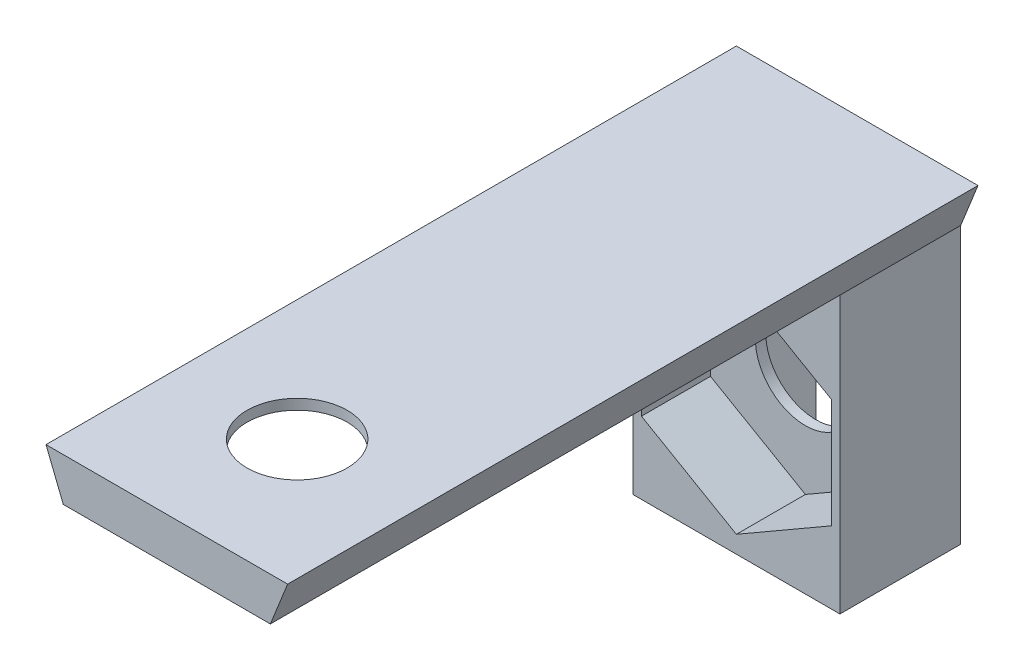
ISO-10303-21;
HEADER;
FILE_DESCRIPTION(('STEP AP214'),'2;1');
FILE_NAME('part.step','',(''),(''),'','','');
FILE_SCHEMA(('AUTOMOTIVE_DESIGN { 1 0 10303 214 1 1 1 1 }'));
ENDSEC;
DATA;
#1=APPLICATION_CONTEXT('core data for automotive mechanical design processes');
#2=APPLICATION_PROTOCOL_DEFINITION('international standard','automotive_design',2000,#1);
#3=PRODUCT_CONTEXT('',#1,'mechanical');
#4=PRODUCT('Part','Part','',(#3));
#5=PRODUCT_RELATED_PRODUCT_CATEGORY('part','',(#4));
#6=PRODUCT_DEFINITION_FORMATION('','',#4);
#7=PRODUCT_DEFINITION_CONTEXT('part definition',#1,'design');
#8=PRODUCT_DEFINITION('design','',#6,#7);
#9=PRODUCT_DEFINITION_SHAPE('','',#8);
#10=(LENGTH_UNIT() NAMED_UNIT(*) SI_UNIT(.MILLI.,.METRE.));
#11=(NAMED_UNIT(*) PLANE_ANGLE_UNIT() SI_UNIT($,.RADIAN.));
#12=(NAMED_UNIT(*) SI_UNIT($,.STERADIAN.) SOLID_ANGLE_UNIT());
#13=UNCERTAINTY_MEASURE_WITH_UNIT(LENGTH_MEASURE(1.E-05),#10,'distance_accuracy_value','');
#14=(GEOMETRIC_REPRESENTATION_CONTEXT(3) GLOBAL_UNCERTAINTY_ASSIGNED_CONTEXT((#13)) GLOBAL_UNIT_ASSIGNED_CONTEXT((#10,
#11,#12)) REPRESENTATION_CONTEXT('',''));
#15=CARTESIAN_POINT('',(0.,0.,0.));
#16=DIRECTION('',(0.,0.,1.));
#17=DIRECTION('',(1.,0.,0.));
#18=AXIS2_PLACEMENT_3D('',#15,#16,#17);
#19=CARTESIAN_POINT('',(0.,7.35,-3.501));
#20=DIRECTION('',(0.,0.,1.));
#21=DIRECTION('',(1.,0.,0.));
#22=AXIS2_PLACEMENT_3D('',#19,#20,#21);
#23=CYLINDRICAL_SURFACE('',#22,2.90000000000001);
#24=CARTESIAN_POINT('',(0.,7.35,-1.1));
#25=DIRECTION('',(0.,0.,1.));
#26=DIRECTION('',(1.,0.,0.));
#27=AXIS2_PLACEMENT_3D('',#24,#25,#26);
#28=CIRCLE('',#27,2.90000000000001);
#29=CARTESIAN_POINT('',(2.90000000000001,7.35,-1.1));
#30=VERTEX_POINT('',#29);
#31=EDGE_CURVE('E324',#30,#30,#28,.F.);
#32=ORIENTED_EDGE('',*,*,#31,.T.);
#33=EDGE_LOOP('',(#32));
#34=FACE_BOUND('',#33,.T.);
#35=CARTESIAN_POINT('',(0.,7.35,-0.500000000000002));
#36=DIRECTION('',(0.,0.,1.));
#37=DIRECTION('',(1.,0.,0.));
#38=AXIS2_PLACEMENT_3D('',#35,#36,#37);
#39=CIRCLE('',#38,2.90000000000001);
#40=CARTESIAN_POINT('',(2.90000000000001,7.35,-0.500000000000002));
#41=VERTEX_POINT('',#40);
#42=EDGE_CURVE('E38',#41,#41,#39,.F.);
#43=ORIENTED_EDGE('',*,*,#42,.F.);
#44=EDGE_LOOP('',(#43));
#45=FACE_BOUND('',#44,.T.);
#46=ADVANCED_FACE('F34',(#34,#45),#23,.F.);
#47=CARTESIAN_POINT('',(6.,16.,3.5));
#48=DIRECTION('',(-1.,0.,0.));
#49=DIRECTION('',(0.,0.,1.));
#50=AXIS2_PLACEMENT_3D('',#47,#48,#49);
#51=PLANE('',#50);
#52=DIRECTION('',(0.,0.,-1.));
#53=VECTOR('',#52,1.);
#54=CARTESIAN_POINT('',(6.,0.,3.5));
#55=LINE('',#54,#53);
#56=CARTESIAN_POINT('',(6.,0.,3.5));
#57=VERTEX_POINT('',#56);
#58=CARTESIAN_POINT('',(6.,0.,-3.5));
#59=VERTEX_POINT('',#58);
#60=EDGE_CURVE('E339',#57,#59,#55,.T.);
#61=ORIENTED_EDGE('',*,*,#60,.T.);
#62=DIRECTION('',(0.,-1.,0.));
#63=VECTOR('',#62,1.);
#64=CARTESIAN_POINT('',(6.,16.,-3.5));
#65=LINE('',#64,#63);
#66=CARTESIAN_POINT('',(6.,16.,-3.5));
#67=VERTEX_POINT('',#66);
#68=EDGE_CURVE('E371',#67,#59,#65,.T.);
#69=ORIENTED_EDGE('',*,*,#68,.F.);
#70=DIRECTION('',(0.,0.,-1.));
#71=VECTOR('',#70,1.);
#72=CARTESIAN_POINT('',(6.,16.,3.5));
#73=LINE('',#72,#71);
#74=CARTESIAN_POINT('',(6.,16.,3.5));
#75=VERTEX_POINT('',#74);
#76=EDGE_CURVE('E345',#75,#67,#73,.T.);
#77=ORIENTED_EDGE('',*,*,#76,.F.);
#78=DIRECTION('',(0.,-1.,0.));
#79=VECTOR('',#78,1.);
#80=CARTESIAN_POINT('',(6.,16.,3.5));
#81=LINE('',#80,#79);
#82=EDGE_CURVE('E353',#75,#57,#81,.T.);
#83=ORIENTED_EDGE('',*,*,#82,.T.);
#84=EDGE_LOOP('',(#61,#69,#77,#83));
#85=FACE_BOUND('',#84,.T.);
#86=ADVANCED_FACE('F36',(#85),#51,.F.);
#87=CARTESIAN_POINT('',(-6.,16.,-3.5));
#88=DIRECTION('',(0.,0.,1.));
#89=DIRECTION('',(1.,0.,0.));
#90=AXIS2_PLACEMENT_3D('',#87,#88,#89);
#91=PLANE('',#90);
#92=DIRECTION('',(-1.,0.,0.));
#93=VECTOR('',#92,1.);
#94=CARTESIAN_POINT('',(-7.,18.5,-3.5));
#95=LINE('',#94,#93);
#96=CARTESIAN_POINT('',(7.,18.5,-3.5));
#97=VERTEX_POINT('',#96);
#98=CARTESIAN_POINT('',(-7.,18.5,-3.5));
#99=VERTEX_POINT('',#98);
#100=EDGE_CURVE('E271',#97,#99,#95,.T.);
#101=ORIENTED_EDGE('',*,*,#100,.F.);
#102=DIRECTION('',(0.371390676354104,0.928476690885259,0.));
#103=VECTOR('',#102,1.);
#104=CARTESIAN_POINT('',(7.,18.5,-3.5));
#105=LINE('',#104,#103);
#106=EDGE_CURVE('E248',#67,#97,#105,.T.);
#107=ORIENTED_EDGE('',*,*,#106,.F.);
#108=ORIENTED_EDGE('',*,*,#68,.T.);
#109=DIRECTION('',(-1.,0.,0.));
#110=VECTOR('',#109,1.);
#111=CARTESIAN_POINT('',(-6.,0.,-3.5));
#112=LINE('',#111,#110);
#113=CARTESIAN_POINT('',(2.4,0.,-3.5));
#114=VERTEX_POINT('',#113);
#115=EDGE_CURVE('E357',#59,#114,#112,.T.);
#116=ORIENTED_EDGE('',*,*,#115,.T.);
#117=DIRECTION('',(0.,1.,0.));
#118=VECTOR('',#117,1.);
#119=CARTESIAN_POINT('',(2.4,-4.,-3.5));
#120=LINE('',#119,#118);
#121=CARTESIAN_POINT('',(2.4,16.,-3.5));
#122=VERTEX_POINT('',#121);
#123=EDGE_CURVE('E336',#114,#122,#120,.T.);
#124=ORIENTED_EDGE('',*,*,#123,.T.);
#125=DIRECTION('',(-1.,0.,0.));
#126=VECTOR('',#125,1.);
#127=CARTESIAN_POINT('',(-7.,16.,-3.5));
#128=LINE('',#127,#126);
#129=CARTESIAN_POINT('',(-2.4,16.,-3.5));
#130=VERTEX_POINT('',#129);
#131=EDGE_CURVE('E265',#122,#130,#128,.T.);
#132=ORIENTED_EDGE('',*,*,#131,.T.);
#133=DIRECTION('',(0.,1.,0.));
#134=VECTOR('',#133,1.);
#135=CARTESIAN_POINT('',(-2.4,-4.,-3.5));
#136=LINE('',#135,#134);
#137=CARTESIAN_POINT('',(-2.4,0.,-3.5));
#138=VERTEX_POINT('',#137);
#139=EDGE_CURVE('E335',#138,#130,#136,.T.);
#140=ORIENTED_EDGE('',*,*,#139,.F.);
#141=CARTESIAN_POINT('',(-6.,0.,-3.5));
#142=VERTEX_POINT('',#141);
#143=EDGE_CURVE('E356',#138,#142,#112,.T.);
#144=ORIENTED_EDGE('',*,*,#143,.T.);
#145=DIRECTION('',(0.,-1.,0.));
#146=VECTOR('',#145,1.);
#147=CARTESIAN_POINT('',(-6.,16.,-3.5));
#148=LINE('',#147,#146);
#149=CARTESIAN_POINT('',(-6.,16.,-3.5));
#150=VERTEX_POINT('',#149);
#151=EDGE_CURVE('E368',#150,#142,#148,.T.);
#152=ORIENTED_EDGE('',*,*,#151,.F.);
#153=DIRECTION('',(0.371390676354104,-0.928476690885259,0.));
#154=VECTOR('',#153,1.);
#155=CARTESIAN_POINT('',(-6.,16.,-3.5));
#156=LINE('',#155,#154);
#157=EDGE_CURVE('E240',#99,#150,#156,.T.);
#158=ORIENTED_EDGE('',*,*,#157,.F.);
#159=EDGE_LOOP('',(#101,#107,#108,#116,#124,#132,#140,#144,#152,#158));
#160=FACE_BOUND('',#159,.T.);
#161=ADVANCED_FACE('F393',(#160),#91,.F.);
#162=CARTESIAN_POINT('',(-6.,16.,3.5));
#163=DIRECTION('',(1.,0.,0.));
#164=DIRECTION('',(0.,0.,-1.));
#165=AXIS2_PLACEMENT_3D('',#162,#163,#164);
#166=PLANE('',#165);
#167=DIRECTION('',(0.,0.,1.));
#168=VECTOR('',#167,1.);
#169=CARTESIAN_POINT('',(-6.,0.,3.5));
#170=LINE('',#169,#168);
#171=CARTESIAN_POINT('',(-6.,0.,3.5));
#172=VERTEX_POINT('',#171);
#173=EDGE_CURVE('E360',#142,#172,#170,.T.);
#174=ORIENTED_EDGE('',*,*,#173,.T.);
#175=DIRECTION('',(0.,-1.,0.));
#176=VECTOR('',#175,1.);
#177=CARTESIAN_POINT('',(-6.,16.,3.5));
#178=LINE('',#177,#176);
#179=CARTESIAN_POINT('',(-6.,16.,3.5));
#180=VERTEX_POINT('',#179);
#181=EDGE_CURVE('E365',#180,#172,#178,.T.);
#182=ORIENTED_EDGE('',*,*,#181,.F.);
#183=DIRECTION('',(0.,0.,1.));
#184=VECTOR('',#183,1.);
#185=CARTESIAN_POINT('',(-6.,16.,3.5));
#186=LINE('',#185,#184);
#187=EDGE_CURVE('E347',#150,#180,#186,.T.);
#188=ORIENTED_EDGE('',*,*,#187,.F.);
#189=ORIENTED_EDGE('',*,*,#151,.T.);
#190=EDGE_LOOP('',(#174,#182,#188,#189));
#191=FACE_BOUND('',#190,.T.);
#192=ADVANCED_FACE('F415',(#191),#166,.F.);
#193=CARTESIAN_POINT('',(-6.,16.,3.5));
#194=DIRECTION('',(0.,0.,-1.));
#195=DIRECTION('',(-1.,0.,0.));
#196=AXIS2_PLACEMENT_3D('',#193,#194,#195);
#197=PLANE('',#196);
#198=DIRECTION('',(-0.866025403784439,-0.5,0.));
#199=VECTOR('',#198,1.);
#200=CARTESIAN_POINT('',(0.,13.7008529610859,3.5));
#201=LINE('',#200,#199);
#202=CARTESIAN_POINT('',(0.,13.7008529610859,3.5));
#203=VERTEX_POINT('',#202);
#204=CARTESIAN_POINT('',(-5.5,10.5254264805429,3.5));
#205=VERTEX_POINT('',#204);
#206=EDGE_CURVE('E299',#203,#205,#201,.T.);
#207=ORIENTED_EDGE('',*,*,#206,.F.);
#208=DIRECTION('',(-0.866025403784439,0.5,0.));
#209=VECTOR('',#208,1.);
#210=CARTESIAN_POINT('',(5.5,10.5254264805429,3.5));
#211=LINE('',#210,#209);
#212=CARTESIAN_POINT('',(5.5,10.5254264805429,3.5));
#213=VERTEX_POINT('',#212);
#214=EDGE_CURVE('E58',#213,#203,#211,.T.);
#215=ORIENTED_EDGE('',*,*,#214,.F.);
#216=DIRECTION('',(0.,1.,0.));
#217=VECTOR('',#216,1.);
#218=CARTESIAN_POINT('',(5.5,4.17457351945706,3.5));
#219=LINE('',#218,#217);
#220=CARTESIAN_POINT('',(5.5,4.17457351945706,3.5));
#221=VERTEX_POINT('',#220);
#222=EDGE_CURVE('E282',#221,#213,#219,.T.);
#223=ORIENTED_EDGE('',*,*,#222,.F.);
#224=DIRECTION('',(0.866025403784439,0.5,0.));
#225=VECTOR('',#224,1.);
#226=CARTESIAN_POINT('',(0.,0.999147038914116,3.5));
#227=LINE('',#226,#225);
#228=CARTESIAN_POINT('',(0.,0.999147038914116,3.5));
#229=VERTEX_POINT('',#228);
#230=EDGE_CURVE('E308',#229,#221,#227,.T.);
#231=ORIENTED_EDGE('',*,*,#230,.F.);
#232=DIRECTION('',(0.866025403784439,-0.5,0.));
#233=VECTOR('',#232,1.);
#234=CARTESIAN_POINT('',(-5.5,4.17457351945706,3.5));
#235=LINE('',#234,#233);
#236=CARTESIAN_POINT('',(-5.5,4.17457351945706,3.5));
#237=VERTEX_POINT('',#236);
#238=EDGE_CURVE('E305',#237,#229,#235,.T.);
#239=ORIENTED_EDGE('',*,*,#238,.F.);
#240=DIRECTION('',(0.,-1.,0.));
#241=VECTOR('',#240,1.);
#242=CARTESIAN_POINT('',(-5.5,10.5254264805429,3.5));
#243=LINE('',#242,#241);
#244=EDGE_CURVE('E302',#205,#237,#243,.T.);
#245=ORIENTED_EDGE('',*,*,#244,.F.);
#246=EDGE_LOOP('',(#207,#215,#223,#231,#239,#245));
#247=FACE_BOUND('',#246,.T.);
#248=DIRECTION('',(1.,0.,0.));
#249=VECTOR('',#248,1.);
#250=CARTESIAN_POINT('',(-6.,0.,3.5));
#251=LINE('',#250,#249);
#252=EDGE_CURVE('E348',#172,#57,#251,.T.);
#253=ORIENTED_EDGE('',*,*,#252,.T.);
#254=ORIENTED_EDGE('',*,*,#82,.F.);
#255=DIRECTION('',(1.,0.,0.));
#256=VECTOR('',#255,1.);
#257=CARTESIAN_POINT('',(-6.,16.,3.5));
#258=LINE('',#257,#256);
#259=EDGE_CURVE('E350',#180,#75,#258,.T.);
#260=ORIENTED_EDGE('',*,*,#259,.F.);
#261=ORIENTED_EDGE('',*,*,#181,.T.);
#262=EDGE_LOOP('',(#253,#254,#260,#261));
#263=FACE_BOUND('',#262,.T.);
#264=ADVANCED_FACE('F410',(#247,#263),#197,.F.);
#265=CARTESIAN_POINT('',(0.,0.,0.));
#266=DIRECTION('',(0.,-1.,0.));
#267=DIRECTION('',(0.,0.,-1.));
#268=AXIS2_PLACEMENT_3D('',#265,#266,#267);
#269=PLANE('',#268);
#270=DIRECTION('',(0.707106781186546,0.,0.707106781186549));
#271=VECTOR('',#270,1.);
#272=CARTESIAN_POINT('',(2.95000000000001,0.,-2.94999999999999));
#273=LINE('',#272,#271);
#274=CARTESIAN_POINT('',(4.79999999999999,0.,-1.1));
#275=VERTEX_POINT('',#274);
#276=EDGE_CURVE('E11',#114,#275,#273,.T.);
#277=ORIENTED_EDGE('',*,*,#276,.F.);
#278=ORIENTED_EDGE('',*,*,#115,.F.);
#279=ORIENTED_EDGE('',*,*,#60,.F.);
#280=ORIENTED_EDGE('',*,*,#252,.F.);
#281=ORIENTED_EDGE('',*,*,#173,.F.);
#282=ORIENTED_EDGE('',*,*,#143,.F.);
#283=DIRECTION('',(0.707106781186551,0.,-0.707106781186544));
#284=VECTOR('',#283,1.);
#285=CARTESIAN_POINT('',(-2.94999999999999,0.,-2.95000000000002));
#286=LINE('',#285,#284);
#287=CARTESIAN_POINT('',(-4.80000000000002,0.,-1.1));
#288=VERTEX_POINT('',#287);
#289=EDGE_CURVE('E374',#288,#138,#286,.T.);
#290=ORIENTED_EDGE('',*,*,#289,.F.);
#291=DIRECTION('',(-1.,0.,0.));
#292=VECTOR('',#291,1.);
#293=CARTESIAN_POINT('',(0.,0.,-1.1));
#294=LINE('',#293,#292);
#295=EDGE_CURVE('E43',#275,#288,#294,.T.);
#296=ORIENTED_EDGE('',*,*,#295,.F.);
#297=EDGE_LOOP('',(#277,#278,#279,#280,#281,#282,#290,#296));
#298=FACE_BOUND('',#297,.T.);
#299=ADVANCED_FACE('F385',(#298),#269,.T.);
#300=CARTESIAN_POINT('',(2.4,-4.,-3.5));
#301=DIRECTION('',(0.707106781186549,0.,-0.707106781186546));
#302=DIRECTION('',(-0.707106781186546,0.,-0.707106781186549));
#303=AXIS2_PLACEMENT_3D('',#300,#301,#302);
#304=PLANE('',#303);
#305=ORIENTED_EDGE('',*,*,#276,.T.);
#306=DIRECTION('',(0.,1.,0.));
#307=VECTOR('',#306,1.);
#308=CARTESIAN_POINT('',(4.79999999999999,-4.,-1.1));
#309=LINE('',#308,#307);
#310=CARTESIAN_POINT('',(4.79999999999999,16.,-1.1));
#311=VERTEX_POINT('',#310);
#312=EDGE_CURVE('E340',#275,#311,#309,.T.);
#313=ORIENTED_EDGE('',*,*,#312,.T.);
#314=DIRECTION('',(-0.707106781186546,0.,-0.707106781186549));
#315=VECTOR('',#314,1.);
#316=CARTESIAN_POINT('',(2.4,16.,-3.5));
#317=LINE('',#316,#315);
#318=EDGE_CURVE('E333',#311,#122,#317,.T.);
#319=ORIENTED_EDGE('',*,*,#318,.T.);
#320=ORIENTED_EDGE('',*,*,#123,.F.);
#321=EDGE_LOOP('',(#305,#313,#319,#320));
#322=FACE_BOUND('',#321,.T.);
#323=ADVANCED_FACE('F401',(#322),#304,.F.);
#324=CARTESIAN_POINT('',(0.,-4.,-1.1));
#325=DIRECTION('',(0.,0.,1.));
#326=DIRECTION('',(1.,0.,0.));
#327=AXIS2_PLACEMENT_3D('',#324,#325,#326);
#328=PLANE('',#327);
#329=ORIENTED_EDGE('',*,*,#31,.F.);
#330=EDGE_LOOP('',(#329));
#331=FACE_BOUND('',#330,.T.);
#332=ORIENTED_EDGE('',*,*,#295,.T.);
#333=DIRECTION('',(0.,1.,0.));
#334=VECTOR('',#333,1.);
#335=CARTESIAN_POINT('',(-4.80000000000002,-4.,-1.1));
#336=LINE('',#335,#334);
#337=CARTESIAN_POINT('',(-4.80000000000002,16.,-1.1));
#338=VERTEX_POINT('',#337);
#339=EDGE_CURVE('E342',#288,#338,#336,.T.);
#340=ORIENTED_EDGE('',*,*,#339,.T.);
#341=DIRECTION('',(1.,0.,0.));
#342=VECTOR('',#341,1.);
#343=CARTESIAN_POINT('',(0.,16.,-1.1));
#344=LINE('',#343,#342);
#345=EDGE_CURVE('E330',#338,#311,#344,.T.);
#346=ORIENTED_EDGE('',*,*,#345,.T.);
#347=ORIENTED_EDGE('',*,*,#312,.F.);
#348=EDGE_LOOP('',(#332,#340,#346,#347));
#349=FACE_BOUND('',#348,.T.);
#350=ADVANCED_FACE('F381',(#331,#349),#328,.F.);
#351=CARTESIAN_POINT('',(-2.4,-4.,-3.5));
#352=DIRECTION('',(-0.707106781186544,0.,-0.707106781186551));
#353=DIRECTION('',(-0.707106781186551,0.,0.707106781186544));
#354=AXIS2_PLACEMENT_3D('',#351,#352,#353);
#355=PLANE('',#354);
#356=ORIENTED_EDGE('',*,*,#289,.T.);
#357=ORIENTED_EDGE('',*,*,#139,.T.);
#358=DIRECTION('',(-0.707106781186551,0.,0.707106781186544));
#359=VECTOR('',#358,1.);
#360=CARTESIAN_POINT('',(-2.4,16.,-3.5));
#361=LINE('',#360,#359);
#362=EDGE_CURVE('E327',#130,#338,#361,.T.);
#363=ORIENTED_EDGE('',*,*,#362,.T.);
#364=ORIENTED_EDGE('',*,*,#339,.F.);
#365=EDGE_LOOP('',(#356,#357,#363,#364));
#366=FACE_BOUND('',#365,.T.);
#367=ADVANCED_FACE('F389',(#366),#355,.F.);
#368=CARTESIAN_POINT('',(0.,0.,-0.500000000000002));
#369=DIRECTION('',(0.,0.,1.));
#370=DIRECTION('',(1.,0.,0.));
#371=AXIS2_PLACEMENT_3D('',#368,#369,#370);
#372=PLANE('',#371);
#373=DIRECTION('',(-0.866025403784439,0.5,0.));
#374=VECTOR('',#373,1.);
#375=CARTESIAN_POINT('',(5.5,10.5254264805429,-0.500000000000002));
#376=LINE('',#375,#374);
#377=CARTESIAN_POINT('',(5.5,10.5254264805429,-0.500000000000002));
#378=VERTEX_POINT('',#377);
#379=CARTESIAN_POINT('',(0.,13.7008529610859,-0.500000000000002));
#380=VERTEX_POINT('',#379);
#381=EDGE_CURVE('E278',#378,#380,#376,.T.);
#382=ORIENTED_EDGE('',*,*,#381,.T.);
#383=DIRECTION('',(-0.866025403784439,-0.5,0.));
#384=VECTOR('',#383,1.);
#385=CARTESIAN_POINT('',(0.,13.7008529610859,-0.500000000000002));
#386=LINE('',#385,#384);
#387=CARTESIAN_POINT('',(-5.5,10.5254264805429,-0.500000000000002));
#388=VERTEX_POINT('',#387);
#389=EDGE_CURVE('E281',#380,#388,#386,.T.);
#390=ORIENTED_EDGE('',*,*,#389,.T.);
#391=DIRECTION('',(0.,-1.,0.));
#392=VECTOR('',#391,1.);
#393=CARTESIAN_POINT('',(-5.5,10.5254264805429,-0.500000000000002));
#394=LINE('',#393,#392);
#395=CARTESIAN_POINT('',(-5.5,4.17457351945706,-0.500000000000002));
#396=VERTEX_POINT('',#395);
#397=EDGE_CURVE('E285',#388,#396,#394,.T.);
#398=ORIENTED_EDGE('',*,*,#397,.T.);
#399=DIRECTION('',(0.866025403784439,-0.5,0.));
#400=VECTOR('',#399,1.);
#401=CARTESIAN_POINT('',(-5.5,4.17457351945706,-0.500000000000002));
#402=LINE('',#401,#400);
#403=CARTESIAN_POINT('',(0.,0.999147038914116,-0.500000000000002));
#404=VERTEX_POINT('',#403);
#405=EDGE_CURVE('E288',#396,#404,#402,.T.);
#406=ORIENTED_EDGE('',*,*,#405,.T.);
#407=DIRECTION('',(0.866025403784439,0.5,0.));
#408=VECTOR('',#407,1.);
#409=CARTESIAN_POINT('',(0.,0.999147038914116,-0.500000000000002));
#410=LINE('',#409,#408);
#411=CARTESIAN_POINT('',(5.5,4.17457351945706,-0.500000000000002));
#412=VERTEX_POINT('',#411);
#413=EDGE_CURVE('E291',#404,#412,#410,.T.);
#414=ORIENTED_EDGE('',*,*,#413,.T.);
#415=DIRECTION('',(0.,1.,0.));
#416=VECTOR('',#415,1.);
#417=CARTESIAN_POINT('',(5.5,4.17457351945706,-0.500000000000002));
#418=LINE('',#417,#416);
#419=EDGE_CURVE('E294',#412,#378,#418,.T.);
#420=ORIENTED_EDGE('',*,*,#419,.T.);
#421=EDGE_LOOP('',(#382,#390,#398,#406,#414,#420));
#422=FACE_BOUND('',#421,.T.);
#423=ORIENTED_EDGE('',*,*,#42,.T.);
#424=EDGE_LOOP('',(#423));
#425=FACE_BOUND('',#424,.T.);
#426=ADVANCED_FACE('F459',(#422,#425),#372,.T.);
#427=CARTESIAN_POINT('',(5.5,10.5254264805429,-0.500000000000002));
#428=DIRECTION('',(0.5,0.866025403784439,0.));
#429=DIRECTION('',(-0.866025403784439,0.5,0.));
#430=AXIS2_PLACEMENT_3D('',#427,#428,#429);
#431=PLANE('',#430);
#432=ORIENTED_EDGE('',*,*,#214,.T.);
#433=DIRECTION('',(0.,0.,1.));
#434=VECTOR('',#433,1.);
#435=CARTESIAN_POINT('',(0.,13.7008529610859,-0.500000000000002));
#436=LINE('',#435,#434);
#437=EDGE_CURVE('E297',#380,#203,#436,.T.);
#438=ORIENTED_EDGE('',*,*,#437,.F.);
#439=ORIENTED_EDGE('',*,*,#381,.F.);
#440=DIRECTION('',(0.,0.,1.));
#441=VECTOR('',#440,1.);
#442=CARTESIAN_POINT('',(5.5,10.5254264805429,-0.500000000000002));
#443=LINE('',#442,#441);
#444=EDGE_CURVE('E313',#378,#213,#443,.T.);
#445=ORIENTED_EDGE('',*,*,#444,.T.);
#446=EDGE_LOOP('',(#432,#438,#439,#445));
#447=FACE_BOUND('',#446,.T.);
#448=ADVANCED_FACE('F450',(#447),#431,.F.);
#449=CARTESIAN_POINT('',(5.5,4.17457351945706,-0.500000000000002));
#450=DIRECTION('',(1.,0.,0.));
#451=DIRECTION('',(0.,0.,-1.));
#452=AXIS2_PLACEMENT_3D('',#449,#450,#451);
#453=PLANE('',#452);
#454=ORIENTED_EDGE('',*,*,#222,.T.);
#455=ORIENTED_EDGE('',*,*,#444,.F.);
#456=ORIENTED_EDGE('',*,*,#419,.F.);
#457=DIRECTION('',(0.,0.,1.));
#458=VECTOR('',#457,1.);
#459=CARTESIAN_POINT('',(5.5,4.17457351945706,-0.500000000000002));
#460=LINE('',#459,#458);
#461=EDGE_CURVE('E315',#412,#221,#460,.T.);
#462=ORIENTED_EDGE('',*,*,#461,.T.);
#463=EDGE_LOOP('',(#454,#455,#456,#462));
#464=FACE_BOUND('',#463,.T.);
#465=ADVANCED_FACE('F511',(#464),#453,.F.);
#466=CARTESIAN_POINT('',(0.,0.999147038914116,-0.500000000000002));
#467=DIRECTION('',(0.5,-0.866025403784439,0.));
#468=DIRECTION('',(0.866025403784439,0.5,0.));
#469=AXIS2_PLACEMENT_3D('',#466,#467,#468);
#470=PLANE('',#469);
#471=ORIENTED_EDGE('',*,*,#230,.T.);
#472=ORIENTED_EDGE('',*,*,#461,.F.);
#473=ORIENTED_EDGE('',*,*,#413,.F.);
#474=DIRECTION('',(0.,0.,1.));
#475=VECTOR('',#474,1.);
#476=CARTESIAN_POINT('',(0.,0.999147038914116,-0.500000000000002));
#477=LINE('',#476,#475);
#478=EDGE_CURVE('E317',#404,#229,#477,.T.);
#479=ORIENTED_EDGE('',*,*,#478,.T.);
#480=EDGE_LOOP('',(#471,#472,#473,#479));
#481=FACE_BOUND('',#480,.T.);
#482=ADVANCED_FACE('F517',(#481),#470,.F.);
#483=CARTESIAN_POINT('',(-5.5,4.17457351945706,-0.500000000000002));
#484=DIRECTION('',(-0.5,-0.866025403784439,0.));
#485=DIRECTION('',(0.866025403784439,-0.5,0.));
#486=AXIS2_PLACEMENT_3D('',#483,#484,#485);
#487=PLANE('',#486);
#488=ORIENTED_EDGE('',*,*,#238,.T.);
#489=ORIENTED_EDGE('',*,*,#478,.F.);
#490=ORIENTED_EDGE('',*,*,#405,.F.);
#491=DIRECTION('',(0.,0.,1.));
#492=VECTOR('',#491,1.);
#493=CARTESIAN_POINT('',(-5.5,4.17457351945706,-0.500000000000002));
#494=LINE('',#493,#492);
#495=EDGE_CURVE('E319',#396,#237,#494,.T.);
#496=ORIENTED_EDGE('',*,*,#495,.T.);
#497=EDGE_LOOP('',(#488,#489,#490,#496));
#498=FACE_BOUND('',#497,.T.);
#499=ADVANCED_FACE('F525',(#498),#487,.F.);
#500=CARTESIAN_POINT('',(-5.5,10.5254264805429,-0.500000000000002));
#501=DIRECTION('',(-1.,0.,0.));
#502=DIRECTION('',(0.,0.,1.));
#503=AXIS2_PLACEMENT_3D('',#500,#501,#502);
#504=PLANE('',#503);
#505=ORIENTED_EDGE('',*,*,#244,.T.);
#506=ORIENTED_EDGE('',*,*,#495,.F.);
#507=ORIENTED_EDGE('',*,*,#397,.F.);
#508=DIRECTION('',(0.,0.,1.));
#509=VECTOR('',#508,1.);
#510=CARTESIAN_POINT('',(-5.5,10.5254264805429,-0.500000000000002));
#511=LINE('',#510,#509);
#512=EDGE_CURVE('E321',#388,#205,#511,.T.);
#513=ORIENTED_EDGE('',*,*,#512,.T.);
#514=EDGE_LOOP('',(#505,#506,#507,#513));
#515=FACE_BOUND('',#514,.T.);
#516=ADVANCED_FACE('F533',(#515),#504,.F.);
#517=CARTESIAN_POINT('',(0.,13.7008529610859,-0.500000000000002));
#518=DIRECTION('',(-0.5,0.866025403784439,0.));
#519=DIRECTION('',(-0.866025403784439,-0.5,0.));
#520=AXIS2_PLACEMENT_3D('',#517,#518,#519);
#521=PLANE('',#520);
#522=ORIENTED_EDGE('',*,*,#206,.T.);
#523=ORIENTED_EDGE('',*,*,#512,.F.);
#524=ORIENTED_EDGE('',*,*,#389,.F.);
#525=ORIENTED_EDGE('',*,*,#437,.T.);
#526=EDGE_LOOP('',(#522,#523,#524,#525));
#527=FACE_BOUND('',#526,.T.);
#528=ADVANCED_FACE('F541',(#527),#521,.F.);
#529=CARTESIAN_POINT('',(0.,16.,0.));
#530=DIRECTION('',(0.,1.,0.));
#531=DIRECTION('',(0.,0.,1.));
#532=AXIS2_PLACEMENT_3D('',#529,#530,#531);
#533=PLANE('',#532);
#534=DIRECTION('',(0.866025403784439,0.,0.5));
#535=VECTOR('',#534,1.);
#536=CARTESIAN_POINT('',(0.,16.,22.5991470389141));
#537=LINE('',#536,#535);
#538=CARTESIAN_POINT('',(0.,16.,22.5991470389141));
#539=VERTEX_POINT('',#538);
#540=CARTESIAN_POINT('',(5.50000000000001,16.,25.7745735194571));
#541=VERTEX_POINT('',#540);
#542=EDGE_CURVE('E227',#539,#541,#537,.T.);
#543=ORIENTED_EDGE('',*,*,#542,.F.);
#544=DIRECTION('',(0.866025403784439,0.,-0.5));
#545=VECTOR('',#544,1.);
#546=CARTESIAN_POINT('',(-5.5,16.,25.7745735194571));
#547=LINE('',#546,#545);
#548=CARTESIAN_POINT('',(-5.5,16.,25.7745735194571));
#549=VERTEX_POINT('',#548);
#550=EDGE_CURVE('E50',#549,#539,#547,.T.);
#551=ORIENTED_EDGE('',*,*,#550,.F.);
#552=DIRECTION('',(0.,0.,-1.));
#553=VECTOR('',#552,1.);
#554=CARTESIAN_POINT('',(-5.5,16.,32.1254264805429));
#555=LINE('',#554,#553);
#556=CARTESIAN_POINT('',(-5.5,16.,32.1254264805429));
#557=VERTEX_POINT('',#556);
#558=EDGE_CURVE('E210',#557,#549,#555,.T.);
#559=ORIENTED_EDGE('',*,*,#558,.F.);
#560=DIRECTION('',(-0.866025403784439,0.,-0.5));
#561=VECTOR('',#560,1.);
#562=CARTESIAN_POINT('',(0.,16.,35.3008529610859));
#563=LINE('',#562,#561);
#564=CARTESIAN_POINT('',(0.,16.,35.3008529610859));
#565=VERTEX_POINT('',#564);
#566=EDGE_CURVE('E213',#565,#557,#563,.T.);
#567=ORIENTED_EDGE('',*,*,#566,.F.);
#568=DIRECTION('',(-0.866025403784438,0.,0.5));
#569=VECTOR('',#568,1.);
#570=CARTESIAN_POINT('',(5.5,16.,32.1254264805429));
#571=LINE('',#570,#569);
#572=CARTESIAN_POINT('',(5.5,16.,32.1254264805429));
#573=VERTEX_POINT('',#572);
#574=EDGE_CURVE('E233',#573,#565,#571,.T.);
#575=ORIENTED_EDGE('',*,*,#574,.F.);
#576=DIRECTION('',(0.,0.,1.));
#577=VECTOR('',#576,1.);
#578=CARTESIAN_POINT('',(5.50000000000001,16.,25.7745735194571));
#579=LINE('',#578,#577);
#580=EDGE_CURVE('E230',#541,#573,#579,.T.);
#581=ORIENTED_EDGE('',*,*,#580,.F.);
#582=EDGE_LOOP('',(#543,#551,#559,#567,#575,#581));
#583=FACE_BOUND('',#582,.T.);
#584=ORIENTED_EDGE('',*,*,#259,.T.);
#585=DIRECTION('',(0.,0.,-1.));
#586=VECTOR('',#585,1.);
#587=CARTESIAN_POINT('',(6.,16.,36.501));
#588=LINE('',#587,#586);
#589=CARTESIAN_POINT('',(6.,16.,36.5));
#590=VERTEX_POINT('',#589);
#591=EDGE_CURVE('E250',#590,#75,#588,.T.);
#592=ORIENTED_EDGE('',*,*,#591,.F.);
#593=DIRECTION('',(1.,0.,0.));
#594=VECTOR('',#593,1.);
#595=CARTESIAN_POINT('',(-6.99999999999999,16.,36.5));
#596=LINE('',#595,#594);
#597=CARTESIAN_POINT('',(-6.,16.,36.5));
#598=VERTEX_POINT('',#597);
#599=EDGE_CURVE('E255',#598,#590,#596,.T.);
#600=ORIENTED_EDGE('',*,*,#599,.F.);
#601=DIRECTION('',(0.,0.,-1.));
#602=VECTOR('',#601,1.);
#603=CARTESIAN_POINT('',(-6.,16.,36.501));
#604=LINE('',#603,#602);
#605=EDGE_CURVE('E257',#598,#180,#604,.T.);
#606=ORIENTED_EDGE('',*,*,#605,.T.);
#607=EDGE_LOOP('',(#584,#592,#600,#606));
#608=FACE_BOUND('',#607,.T.);
#609=ADVANCED_FACE('F430',(#583,#608),#533,.F.);
#610=CARTESIAN_POINT('',(-6.99999999999999,18.5,36.5));
#611=DIRECTION('',(0.,0.,-1.));
#612=DIRECTION('',(-1.,0.,0.));
#613=AXIS2_PLACEMENT_3D('',#610,#611,#612);
#614=PLANE('',#613);
#615=ORIENTED_EDGE('',*,*,#599,.T.);
#616=DIRECTION('',(-0.371390676354104,-0.928476690885259,0.));
#617=VECTOR('',#616,1.);
#618=CARTESIAN_POINT('',(7.,18.5,36.5));
#619=LINE('',#618,#617);
#620=CARTESIAN_POINT('',(7.,18.5,36.5));
#621=VERTEX_POINT('',#620);
#622=EDGE_CURVE('E253',#621,#590,#619,.T.);
#623=ORIENTED_EDGE('',*,*,#622,.F.);
#624=DIRECTION('',(1.,0.,0.));
#625=VECTOR('',#624,1.);
#626=CARTESIAN_POINT('',(-6.99999999999999,18.5,36.5));
#627=LINE('',#626,#625);
#628=CARTESIAN_POINT('',(-6.99999999999999,18.5,36.5));
#629=VERTEX_POINT('',#628);
#630=EDGE_CURVE('E264',#629,#621,#627,.T.);
#631=ORIENTED_EDGE('',*,*,#630,.F.);
#632=DIRECTION('',(-0.371390676354104,0.928476690885259,0.));
#633=VECTOR('',#632,1.);
#634=CARTESIAN_POINT('',(-6.,16.,36.5));
#635=LINE('',#634,#633);
#636=EDGE_CURVE('E251',#598,#629,#635,.T.);
#637=ORIENTED_EDGE('',*,*,#636,.F.);
#638=EDGE_LOOP('',(#615,#623,#631,#637));
#639=FACE_BOUND('',#638,.T.);
#640=ADVANCED_FACE('F426',(#639),#614,.F.);
#641=CARTESIAN_POINT('',(0.,18.5,0.));
#642=DIRECTION('',(0.,1.,0.));
#643=DIRECTION('',(0.,0.,1.));
#644=AXIS2_PLACEMENT_3D('',#641,#642,#643);
#645=PLANE('',#644);
#646=CARTESIAN_POINT('',(0.,18.5,28.95));
#647=DIRECTION('',(0.,1.,0.));
#648=DIRECTION('',(0.,0.,1.));
#649=AXIS2_PLACEMENT_3D('',#646,#647,#648);
#650=CIRCLE('',#649,2.9);
#651=CARTESIAN_POINT('',(0.,18.5,31.85));
#652=VERTEX_POINT('',#651);
#653=EDGE_CURVE('E216',#652,#652,#650,.F.);
#654=ORIENTED_EDGE('',*,*,#653,.T.);
#655=EDGE_LOOP('',(#654));
#656=FACE_BOUND('',#655,.T.);
#657=DIRECTION('',(0.,0.,1.));
#658=VECTOR('',#657,1.);
#659=CARTESIAN_POINT('',(-7.,18.5,-3.5));
#660=LINE('',#659,#658);
#661=EDGE_CURVE('E261',#99,#629,#660,.T.);
#662=ORIENTED_EDGE('',*,*,#661,.T.);
#663=ORIENTED_EDGE('',*,*,#630,.T.);
#664=DIRECTION('',(0.,0.,-1.));
#665=VECTOR('',#664,1.);
#666=CARTESIAN_POINT('',(7.,18.5,-3.5));
#667=LINE('',#666,#665);
#668=EDGE_CURVE('E268',#621,#97,#667,.T.);
#669=ORIENTED_EDGE('',*,*,#668,.T.);
#670=ORIENTED_EDGE('',*,*,#100,.T.);
#671=EDGE_LOOP('',(#662,#663,#669,#670));
#672=FACE_BOUND('',#671,.T.);
#673=ADVANCED_FACE('F419',(#656,#672),#645,.T.);
#674=ORIENTED_EDGE('',*,*,#318,.F.);
#675=ORIENTED_EDGE('',*,*,#345,.F.);
#676=ORIENTED_EDGE('',*,*,#362,.F.);
#677=ORIENTED_EDGE('',*,*,#131,.F.);
#678=EDGE_LOOP('',(#674,#675,#676,#677));
#679=FACE_BOUND('',#678,.T.);
#680=ADVANCED_FACE('F398',(#679),#533,.F.);
#681=CARTESIAN_POINT('',(-6.,16.,36.501));
#682=DIRECTION('',(0.928476690885259,0.371390676354104,0.));
#683=DIRECTION('',(-0.371390676354104,0.928476690885259,0.));
#684=AXIS2_PLACEMENT_3D('',#681,#682,#683);
#685=PLANE('',#684);
#686=ORIENTED_EDGE('',*,*,#636,.T.);
#687=ORIENTED_EDGE('',*,*,#661,.F.);
#688=ORIENTED_EDGE('',*,*,#157,.T.);
#689=ORIENTED_EDGE('',*,*,#187,.T.);
#690=ORIENTED_EDGE('',*,*,#605,.F.);
#691=EDGE_LOOP('',(#686,#687,#688,#689,#690));
#692=FACE_BOUND('',#691,.T.);
#693=ADVANCED_FACE('F431',(#692),#685,.F.);
#694=CARTESIAN_POINT('',(7.,18.5,36.501));
#695=DIRECTION('',(-0.928476690885259,0.371390676354104,0.));
#696=DIRECTION('',(-0.371390676354104,-0.928476690885259,0.));
#697=AXIS2_PLACEMENT_3D('',#694,#695,#696);
#698=PLANE('',#697);
#699=ORIENTED_EDGE('',*,*,#622,.T.);
#700=ORIENTED_EDGE('',*,*,#591,.T.);
#701=ORIENTED_EDGE('',*,*,#76,.T.);
#702=ORIENTED_EDGE('',*,*,#106,.T.);
#703=ORIENTED_EDGE('',*,*,#668,.F.);
#704=EDGE_LOOP('',(#699,#700,#701,#702,#703));
#705=FACE_BOUND('',#704,.T.);
#706=ADVANCED_FACE('F423',(#705),#698,.F.);
#707=CARTESIAN_POINT('',(-5.5,17.9,25.7745735194571));
#708=DIRECTION('',(-0.5,0.,-0.866025403784438));
#709=DIRECTION('',(-0.866025403784439,0.,0.5));
#710=AXIS2_PLACEMENT_3D('',#707,#708,#709);
#711=PLANE('',#710);
#712=ORIENTED_EDGE('',*,*,#550,.T.);
#713=DIRECTION('',(0.,-1.,0.));
#714=VECTOR('',#713,1.);
#715=CARTESIAN_POINT('',(0.,17.9,22.5991470389141));
#716=LINE('',#715,#714);
#717=CARTESIAN_POINT('',(0.,17.9,22.5991470389141));
#718=VERTEX_POINT('',#717);
#719=EDGE_CURVE('E187',#718,#539,#716,.T.);
#720=ORIENTED_EDGE('',*,*,#719,.F.);
#721=DIRECTION('',(0.866025403784439,0.,-0.5));
#722=VECTOR('',#721,1.);
#723=CARTESIAN_POINT('',(-5.5,17.9,25.7745735194571));
#724=LINE('',#723,#722);
#725=CARTESIAN_POINT('',(-5.5,17.9,25.7745735194571));
#726=VERTEX_POINT('',#725);
#727=EDGE_CURVE('E191',#726,#718,#724,.T.);
#728=ORIENTED_EDGE('',*,*,#727,.F.);
#729=DIRECTION('',(0.,-1.,0.));
#730=VECTOR('',#729,1.);
#731=CARTESIAN_POINT('',(-5.5,17.9,25.7745735194571));
#732=LINE('',#731,#730);
#733=EDGE_CURVE('E238',#726,#549,#732,.T.);
#734=ORIENTED_EDGE('',*,*,#733,.T.);
#735=EDGE_LOOP('',(#712,#720,#728,#734));
#736=FACE_BOUND('',#735,.T.);
#737=ADVANCED_FACE('F189',(#736),#711,.F.);
#738=CARTESIAN_POINT('',(-5.5,17.9,32.1254264805429));
#739=DIRECTION('',(-1.,0.,0.));
#740=DIRECTION('',(0.,0.,1.));
#741=AXIS2_PLACEMENT_3D('',#738,#739,#740);
#742=PLANE('',#741);
#743=ORIENTED_EDGE('',*,*,#558,.T.);
#744=ORIENTED_EDGE('',*,*,#733,.F.);
#745=DIRECTION('',(0.,0.,-1.));
#746=VECTOR('',#745,1.);
#747=CARTESIAN_POINT('',(-5.5,17.9,32.1254264805429));
#748=LINE('',#747,#746);
#749=CARTESIAN_POINT('',(-5.5,17.9,32.1254264805429));
#750=VERTEX_POINT('',#749);
#751=EDGE_CURVE('E197',#750,#726,#748,.T.);
#752=ORIENTED_EDGE('',*,*,#751,.F.);
#753=DIRECTION('',(0.,-1.,0.));
#754=VECTOR('',#753,1.);
#755=CARTESIAN_POINT('',(-5.5,17.9,32.1254264805429));
#756=LINE('',#755,#754);
#757=EDGE_CURVE('E241',#750,#557,#756,.T.);
#758=ORIENTED_EDGE('',*,*,#757,.T.);
#759=EDGE_LOOP('',(#743,#744,#752,#758));
#760=FACE_BOUND('',#759,.T.);
#761=ADVANCED_FACE('F637',(#760),#742,.F.);
#762=CARTESIAN_POINT('',(0.,17.9,35.3008529610859));
#763=DIRECTION('',(-0.5,0.,0.866025403784439));
#764=DIRECTION('',(0.866025403784439,0.,0.5));
#765=AXIS2_PLACEMENT_3D('',#762,#763,#764);
#766=PLANE('',#765);
#767=ORIENTED_EDGE('',*,*,#566,.T.);
#768=ORIENTED_EDGE('',*,*,#757,.F.);
#769=DIRECTION('',(-0.866025403784439,0.,-0.5));
#770=VECTOR('',#769,1.);
#771=CARTESIAN_POINT('',(0.,17.9,35.3008529610859));
#772=LINE('',#771,#770);
#773=CARTESIAN_POINT('',(0.,17.9,35.3008529610859));
#774=VERTEX_POINT('',#773);
#775=EDGE_CURVE('E223',#774,#750,#772,.T.);
#776=ORIENTED_EDGE('',*,*,#775,.F.);
#777=DIRECTION('',(0.,-1.,0.));
#778=VECTOR('',#777,1.);
#779=CARTESIAN_POINT('',(0.,17.9,35.3008529610859));
#780=LINE('',#779,#778);
#781=EDGE_CURVE('E243',#774,#565,#780,.T.);
#782=ORIENTED_EDGE('',*,*,#781,.T.);
#783=EDGE_LOOP('',(#767,#768,#776,#782));
#784=FACE_BOUND('',#783,.T.);
#785=ADVANCED_FACE('F645',(#784),#766,.F.);
#786=CARTESIAN_POINT('',(5.5,17.9,32.1254264805429));
#787=DIRECTION('',(0.5,0.,0.866025403784438));
#788=DIRECTION('',(0.866025403784438,0.,-0.5));
#789=AXIS2_PLACEMENT_3D('',#786,#787,#788);
#790=PLANE('',#789);
#791=ORIENTED_EDGE('',*,*,#574,.T.);
#792=ORIENTED_EDGE('',*,*,#781,.F.);
#793=DIRECTION('',(-0.866025403784438,0.,0.5));
#794=VECTOR('',#793,1.);
#795=CARTESIAN_POINT('',(5.5,17.9,32.1254264805429));
#796=LINE('',#795,#794);
#797=CARTESIAN_POINT('',(5.5,17.9,32.1254264805429));
#798=VERTEX_POINT('',#797);
#799=EDGE_CURVE('E220',#798,#774,#796,.T.);
#800=ORIENTED_EDGE('',*,*,#799,.F.);
#801=DIRECTION('',(0.,-1.,0.));
#802=VECTOR('',#801,1.);
#803=CARTESIAN_POINT('',(5.5,17.9,32.1254264805429));
#804=LINE('',#803,#802);
#805=EDGE_CURVE('E245',#798,#573,#804,.T.);
#806=ORIENTED_EDGE('',*,*,#805,.T.);
#807=EDGE_LOOP('',(#791,#792,#800,#806));
#808=FACE_BOUND('',#807,.T.);
#809=ADVANCED_FACE('F654',(#808),#790,.F.);
#810=CARTESIAN_POINT('',(5.50000000000001,17.9,25.7745735194571));
#811=DIRECTION('',(1.,0.,0.));
#812=DIRECTION('',(0.,0.,-1.));
#813=AXIS2_PLACEMENT_3D('',#810,#811,#812);
#814=PLANE('',#813);
#815=ORIENTED_EDGE('',*,*,#580,.T.);
#816=ORIENTED_EDGE('',*,*,#805,.F.);
#817=DIRECTION('',(0.,0.,1.));
#818=VECTOR('',#817,1.);
#819=CARTESIAN_POINT('',(5.50000000000001,17.9,25.7745735194571));
#820=LINE('',#819,#818);
#821=CARTESIAN_POINT('',(5.50000000000001,17.9,25.7745735194571));
#822=VERTEX_POINT('',#821);
#823=EDGE_CURVE('E205',#822,#798,#820,.T.);
#824=ORIENTED_EDGE('',*,*,#823,.F.);
#825=DIRECTION('',(0.,-1.,0.));
#826=VECTOR('',#825,1.);
#827=CARTESIAN_POINT('',(5.50000000000001,17.9,25.7745735194571));
#828=LINE('',#827,#826);
#829=EDGE_CURVE('E196',#822,#541,#828,.T.);
#830=ORIENTED_EDGE('',*,*,#829,.T.);
#831=EDGE_LOOP('',(#815,#816,#824,#830));
#832=FACE_BOUND('',#831,.T.);
#833=ADVANCED_FACE('F663',(#832),#814,.F.);
#834=CARTESIAN_POINT('',(0.,17.9,22.5991470389141));
#835=DIRECTION('',(0.5,0.,-0.866025403784438));
#836=DIRECTION('',(-0.866025403784439,0.,-0.5));
#837=AXIS2_PLACEMENT_3D('',#834,#835,#836);
#838=PLANE('',#837);
#839=ORIENTED_EDGE('',*,*,#542,.T.);
#840=ORIENTED_EDGE('',*,*,#829,.F.);
#841=DIRECTION('',(0.866025403784439,0.,0.5));
#842=VECTOR('',#841,1.);
#843=CARTESIAN_POINT('',(0.,17.9,22.5991470389141));
#844=LINE('',#843,#842);
#845=EDGE_CURVE('E200',#718,#822,#844,.T.);
#846=ORIENTED_EDGE('',*,*,#845,.F.);
#847=ORIENTED_EDGE('',*,*,#719,.T.);
#848=EDGE_LOOP('',(#839,#840,#846,#847));
#849=FACE_BOUND('',#848,.T.);
#850=ADVANCED_FACE('F201',(#849),#838,.F.);
#851=CARTESIAN_POINT('',(0.,17.9,0.));
#852=DIRECTION('',(0.,-1.,0.));
#853=DIRECTION('',(0.,0.,-1.));
#854=AXIS2_PLACEMENT_3D('',#851,#852,#853);
#855=PLANE('',#854);
#856=CARTESIAN_POINT('',(0.,17.9,28.95));
#857=DIRECTION('',(0.,-1.,0.));
#858=DIRECTION('',(0.,0.,-1.));
#859=AXIS2_PLACEMENT_3D('',#856,#857,#858);
#860=CIRCLE('',#859,2.9);
#861=CARTESIAN_POINT('',(0.,17.9,26.05));
#862=VERTEX_POINT('',#861);
#863=EDGE_CURVE('E228',#862,#862,#860,.T.);
#864=ORIENTED_EDGE('',*,*,#863,.F.);
#865=EDGE_LOOP('',(#864));
#866=FACE_BOUND('',#865,.T.);
#867=ORIENTED_EDGE('',*,*,#727,.T.);
#868=ORIENTED_EDGE('',*,*,#845,.T.);
#869=ORIENTED_EDGE('',*,*,#823,.T.);
#870=ORIENTED_EDGE('',*,*,#799,.T.);
#871=ORIENTED_EDGE('',*,*,#775,.T.);
#872=ORIENTED_EDGE('',*,*,#751,.T.);
#873=EDGE_LOOP('',(#867,#868,#869,#870,#871,#872));
#874=FACE_BOUND('',#873,.T.);
#875=ADVANCED_FACE('F207',(#866,#874),#855,.T.);
#876=CARTESIAN_POINT('',(0.,18.501,28.95));
#877=DIRECTION('',(0.,-1.,0.));
#878=DIRECTION('',(0.,0.,-1.));
#879=AXIS2_PLACEMENT_3D('',#876,#877,#878);
#880=CYLINDRICAL_SURFACE('',#879,2.9);
#881=ORIENTED_EDGE('',*,*,#653,.F.);
#882=EDGE_LOOP('',(#881));
#883=FACE_BOUND('',#882,.T.);
#884=ORIENTED_EDGE('',*,*,#863,.T.);
#885=EDGE_LOOP('',(#884));
#886=FACE_BOUND('',#885,.T.);
#887=ADVANCED_FACE('F685',(#883,#886),#880,.F.);
#888=CLOSED_SHELL('',(#46,#86,#161,#192,#264,#299,#323,#350,#367,#426,#448,#465,#482,#499,#516,
#528,#609,#640,#673,#680,#693,#706,#737,#761,#785,#809,#833,#850,#875,#887));
#889=MANIFOLD_SOLID_BREP('B2',#888);
#890=ADVANCED_BREP_SHAPE_REPRESENTATION('',(#18,#889),#14);
#891=SHAPE_DEFINITION_REPRESENTATION(#9,#890);
ENDSEC;
END-ISO-10303-21;
